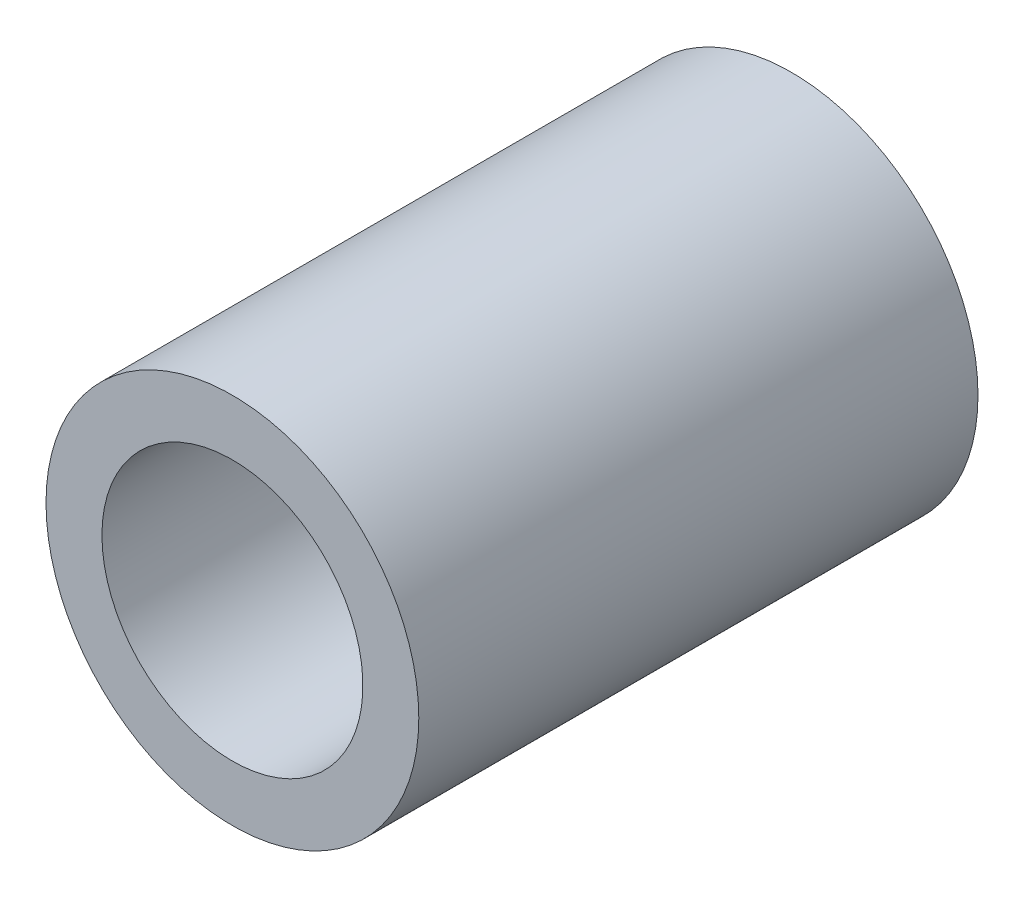
ISO-10303-21;
HEADER;
FILE_DESCRIPTION(('STEP AP214'),'2;1');
FILE_NAME('part.step','',(''),(''),'','','');
FILE_SCHEMA(('AUTOMOTIVE_DESIGN { 1 0 10303 214 1 1 1 1 }'));
ENDSEC;
DATA;
#1=APPLICATION_CONTEXT('core data for automotive mechanical design processes');
#2=APPLICATION_PROTOCOL_DEFINITION('international standard','automotive_design',2000,#1);
#3=PRODUCT_CONTEXT('',#1,'mechanical');
#4=PRODUCT('Part','Part','',(#3));
#5=PRODUCT_RELATED_PRODUCT_CATEGORY('part','',(#4));
#6=PRODUCT_DEFINITION_FORMATION('','',#4);
#7=PRODUCT_DEFINITION_CONTEXT('part definition',#1,'design');
#8=PRODUCT_DEFINITION('design','',#6,#7);
#9=PRODUCT_DEFINITION_SHAPE('','',#8);
#10=(LENGTH_UNIT() NAMED_UNIT(*) SI_UNIT(.MILLI.,.METRE.));
#11=(NAMED_UNIT(*) PLANE_ANGLE_UNIT() SI_UNIT($,.RADIAN.));
#12=(NAMED_UNIT(*) SI_UNIT($,.STERADIAN.) SOLID_ANGLE_UNIT());
#13=UNCERTAINTY_MEASURE_WITH_UNIT(LENGTH_MEASURE(1.E-05),#10,'distance_accuracy_value','');
#14=(GEOMETRIC_REPRESENTATION_CONTEXT(3) GLOBAL_UNCERTAINTY_ASSIGNED_CONTEXT((#13)) GLOBAL_UNIT_ASSIGNED_CONTEXT((#10,
#11,#12)) REPRESENTATION_CONTEXT('',''));
#15=CARTESIAN_POINT('',(0.,0.,0.));
#16=DIRECTION('',(0.,0.,1.));
#17=DIRECTION('',(1.,0.,0.));
#18=AXIS2_PLACEMENT_3D('',#15,#16,#17);
#19=CARTESIAN_POINT('',(0.,0.,-6.));
#20=DIRECTION('',(0.,0.,1.));
#21=DIRECTION('',(1.,0.,0.));
#22=AXIS2_PLACEMENT_3D('',#19,#20,#21);
#23=CYLINDRICAL_SURFACE('',#22,2.);
#24=CARTESIAN_POINT('',(0.,0.,-6.));
#25=DIRECTION('',(0.,0.,-1.));
#26=DIRECTION('',(-1.,0.,0.));
#27=AXIS2_PLACEMENT_3D('',#24,#25,#26);
#28=CIRCLE('',#27,2.);
#29=CARTESIAN_POINT('',(-2.,0.,-6.));
#30=VERTEX_POINT('',#29);
#31=EDGE_CURVE('E10',#30,#30,#28,.T.);
#32=ORIENTED_EDGE('',*,*,#31,.F.);
#33=EDGE_LOOP('',(#32));
#34=FACE_BOUND('',#33,.T.);
#35=CARTESIAN_POINT('',(0.,0.,0.));
#36=DIRECTION('',(0.,0.,-1.));
#37=DIRECTION('',(-1.,0.,0.));
#38=AXIS2_PLACEMENT_3D('',#35,#36,#37);
#39=CIRCLE('',#38,2.);
#40=CARTESIAN_POINT('',(-2.,0.,0.));
#41=VERTEX_POINT('',#40);
#42=EDGE_CURVE('E40',#41,#41,#39,.T.);
#43=ORIENTED_EDGE('',*,*,#42,.T.);
#44=EDGE_LOOP('',(#43));
#45=FACE_BOUND('',#44,.T.);
#46=ADVANCED_FACE('F37',(#34,#45),#23,.T.);
#47=CARTESIAN_POINT('',(0.,0.,-6.));
#48=DIRECTION('',(0.,0.,-1.));
#49=DIRECTION('',(-1.,0.,0.));
#50=AXIS2_PLACEMENT_3D('',#47,#48,#49);
#51=PLANE('',#50);
#52=CARTESIAN_POINT('',(0.,0.,-6.));
#53=DIRECTION('',(0.,0.,-1.));
#54=DIRECTION('',(-1.,0.,0.));
#55=AXIS2_PLACEMENT_3D('',#52,#53,#54);
#56=CIRCLE('',#55,1.4);
#57=CARTESIAN_POINT('',(-1.4,0.,-6.));
#58=VERTEX_POINT('',#57);
#59=EDGE_CURVE('E54',#58,#58,#56,.T.);
#60=ORIENTED_EDGE('',*,*,#59,.F.);
#61=EDGE_LOOP('',(#60));
#62=FACE_BOUND('',#61,.T.);
#63=ORIENTED_EDGE('',*,*,#31,.T.);
#64=EDGE_LOOP('',(#63));
#65=FACE_BOUND('',#64,.T.);
#66=ADVANCED_FACE('F62',(#62,#65),#51,.T.);
#67=CARTESIAN_POINT('',(0.,0.,0.));
#68=DIRECTION('',(0.,0.,-1.));
#69=DIRECTION('',(-1.,0.,0.));
#70=AXIS2_PLACEMENT_3D('',#67,#68,#69);
#71=PLANE('',#70);
#72=CARTESIAN_POINT('',(0.,0.,0.));
#73=DIRECTION('',(0.,0.,-1.));
#74=DIRECTION('',(-1.,0.,0.));
#75=AXIS2_PLACEMENT_3D('',#72,#73,#74);
#76=CIRCLE('',#75,1.4);
#77=CARTESIAN_POINT('',(-1.4,0.,0.));
#78=VERTEX_POINT('',#77);
#79=EDGE_CURVE('E49',#78,#78,#76,.T.);
#80=ORIENTED_EDGE('',*,*,#79,.T.);
#81=EDGE_LOOP('',(#80));
#82=FACE_BOUND('',#81,.T.);
#83=ORIENTED_EDGE('',*,*,#42,.F.);
#84=EDGE_LOOP('',(#83));
#85=FACE_BOUND('',#84,.T.);
#86=ADVANCED_FACE('F64',(#82,#85),#71,.F.);
#87=CARTESIAN_POINT('',(0.,0.,6.));
#88=DIRECTION('',(0.,0.,-1.));
#89=DIRECTION('',(-1.,0.,0.));
#90=AXIS2_PLACEMENT_3D('',#87,#88,#89);
#91=CYLINDRICAL_SURFACE('',#90,1.4);
#92=ORIENTED_EDGE('',*,*,#59,.T.);
#93=EDGE_LOOP('',(#92));
#94=FACE_BOUND('',#93,.T.);
#95=ORIENTED_EDGE('',*,*,#79,.F.);
#96=EDGE_LOOP('',(#95));
#97=FACE_BOUND('',#96,.T.);
#98=ADVANCED_FACE('F59',(#94,#97),#91,.F.);
#99=CLOSED_SHELL('',(#46,#66,#86,#98));
#100=MANIFOLD_SOLID_BREP('B2',#99);
#101=ADVANCED_BREP_SHAPE_REPRESENTATION('',(#18,#100),#14);
#102=SHAPE_DEFINITION_REPRESENTATION(#9,#101);
ENDSEC;
END-ISO-10303-21;
